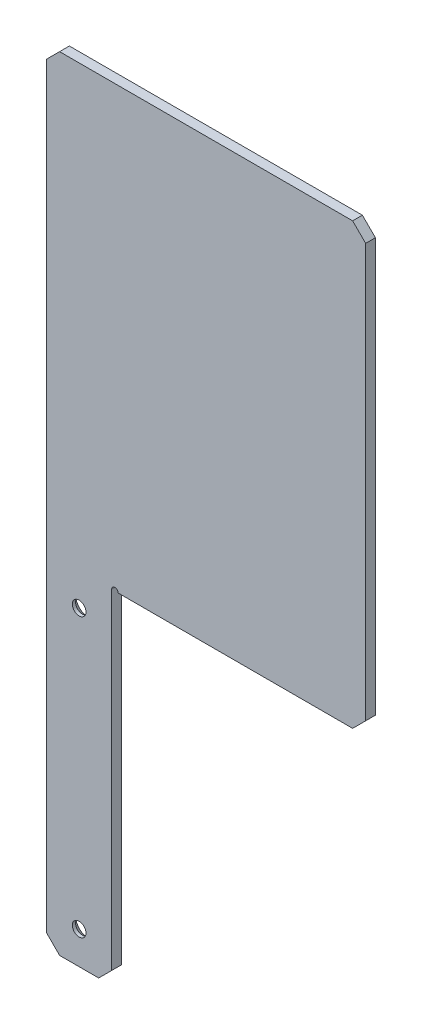
ISO-10303-21;
HEADER;
FILE_DESCRIPTION(('STEP AP214'),'2;1');
FILE_NAME('part.step','',(''),(''),'','','');
FILE_SCHEMA(('AUTOMOTIVE_DESIGN { 1 0 10303 214 1 1 1 1 }'));
ENDSEC;
DATA;
#1=APPLICATION_CONTEXT('core data for automotive mechanical design processes');
#2=APPLICATION_PROTOCOL_DEFINITION('international standard','automotive_design',2000,#1);
#3=PRODUCT_CONTEXT('',#1,'mechanical');
#4=PRODUCT('Part','Part','',(#3));
#5=PRODUCT_RELATED_PRODUCT_CATEGORY('part','',(#4));
#6=PRODUCT_DEFINITION_FORMATION('','',#4);
#7=PRODUCT_DEFINITION_CONTEXT('part definition',#1,'design');
#8=PRODUCT_DEFINITION('design','',#6,#7);
#9=PRODUCT_DEFINITION_SHAPE('','',#8);
#10=(LENGTH_UNIT() NAMED_UNIT(*) SI_UNIT(.MILLI.,.METRE.));
#11=(NAMED_UNIT(*) PLANE_ANGLE_UNIT() SI_UNIT($,.RADIAN.));
#12=(NAMED_UNIT(*) SI_UNIT($,.STERADIAN.) SOLID_ANGLE_UNIT());
#13=UNCERTAINTY_MEASURE_WITH_UNIT(LENGTH_MEASURE(1.E-05),#10,'distance_accuracy_value','');
#14=(GEOMETRIC_REPRESENTATION_CONTEXT(3) GLOBAL_UNCERTAINTY_ASSIGNED_CONTEXT((#13)) GLOBAL_UNIT_ASSIGNED_CONTEXT((#10,
#11,#12)) REPRESENTATION_CONTEXT('',''));
#15=CARTESIAN_POINT('',(0.,0.,0.));
#16=DIRECTION('',(0.,0.,1.));
#17=DIRECTION('',(1.,0.,0.));
#18=AXIS2_PLACEMENT_3D('',#15,#16,#17);
#19=CARTESIAN_POINT('',(-49.,-120.2,1.5));
#20=DIRECTION('',(0.,1.,0.));
#21=DIRECTION('',(0.,0.,1.));
#22=AXIS2_PLACEMENT_3D('',#19,#20,#21);
#23=PLANE('',#22);
#24=DIRECTION('',(1.,0.,0.));
#25=VECTOR('',#24,1.);
#26=CARTESIAN_POINT('',(-49.,-120.2,1.5));
#27=LINE('',#26,#25);
#28=CARTESIAN_POINT('',(-45.,-120.2,1.5));
#29=VERTEX_POINT('',#28);
#30=CARTESIAN_POINT('',(-33.,-120.2,1.5));
#31=VERTEX_POINT('',#30);
#32=EDGE_CURVE('E317',#29,#31,#27,.T.);
#33=ORIENTED_EDGE('',*,*,#32,.F.);
#34=DIRECTION('',(0.,0.,-1.));
#35=VECTOR('',#34,1.);
#36=CARTESIAN_POINT('',(-45.,-120.2,1.5));
#37=LINE('',#36,#35);
#38=CARTESIAN_POINT('',(-45.,-120.2,-1.5));
#39=VERTEX_POINT('',#38);
#40=EDGE_CURVE('E199',#29,#39,#37,.T.);
#41=ORIENTED_EDGE('',*,*,#40,.T.);
#42=DIRECTION('',(1.,0.,0.));
#43=VECTOR('',#42,1.);
#44=CARTESIAN_POINT('',(-49.,-120.2,-1.5));
#45=LINE('',#44,#43);
#46=CARTESIAN_POINT('',(-33.,-120.2,-1.5));
#47=VERTEX_POINT('',#46);
#48=EDGE_CURVE('E147',#39,#47,#45,.T.);
#49=ORIENTED_EDGE('',*,*,#48,.T.);
#50=DIRECTION('',(0.,0.,1.));
#51=VECTOR('',#50,1.);
#52=CARTESIAN_POINT('',(-33.,-120.2,1.5));
#53=LINE('',#52,#51);
#54=EDGE_CURVE('E197',#47,#31,#53,.T.);
#55=ORIENTED_EDGE('',*,*,#54,.T.);
#56=EDGE_LOOP('',(#33,#41,#49,#55));
#57=FACE_BOUND('',#56,.T.);
#58=ADVANCED_FACE('F37',(#57),#23,.F.);
#59=CARTESIAN_POINT('',(-29.,-120.2,1.5));
#60=DIRECTION('',(-1.,0.,0.));
#61=DIRECTION('',(0.,0.,1.));
#62=AXIS2_PLACEMENT_3D('',#59,#60,#61);
#63=PLANE('',#62);
#64=DIRECTION('',(0.,1.,0.));
#65=VECTOR('',#64,1.);
#66=CARTESIAN_POINT('',(-29.,-120.2,1.5));
#67=LINE('',#66,#65);
#68=CARTESIAN_POINT('',(-29.,-116.2,1.5));
#69=VERTEX_POINT('',#68);
#70=CARTESIAN_POINT('',(-29.,-14.8,1.5));
#71=VERTEX_POINT('',#70);
#72=EDGE_CURVE('E316',#69,#71,#67,.T.);
#73=ORIENTED_EDGE('',*,*,#72,.F.);
#74=DIRECTION('',(0.,0.,-1.));
#75=VECTOR('',#74,1.);
#76=CARTESIAN_POINT('',(-29.,-116.2,1.5));
#77=LINE('',#76,#75);
#78=CARTESIAN_POINT('',(-29.,-116.2,-1.5));
#79=VERTEX_POINT('',#78);
#80=EDGE_CURVE('E202',#69,#79,#77,.T.);
#81=ORIENTED_EDGE('',*,*,#80,.T.);
#82=DIRECTION('',(0.,1.,0.));
#83=VECTOR('',#82,1.);
#84=CARTESIAN_POINT('',(-29.,-120.2,-1.5));
#85=LINE('',#84,#83);
#86=CARTESIAN_POINT('',(-29.,-14.8,-1.5));
#87=VERTEX_POINT('',#86);
#88=EDGE_CURVE('E154',#79,#87,#85,.T.);
#89=ORIENTED_EDGE('',*,*,#88,.T.);
#90=DIRECTION('',(0.,0.,-1.));
#91=VECTOR('',#90,1.);
#92=CARTESIAN_POINT('',(-29.,-14.8,1.5));
#93=LINE('',#92,#91);
#94=EDGE_CURVE('E133',#71,#87,#93,.T.);
#95=ORIENTED_EDGE('',*,*,#94,.F.);
#96=EDGE_LOOP('',(#73,#81,#89,#95));
#97=FACE_BOUND('',#96,.T.);
#98=ADVANCED_FACE('F240',(#97),#63,.F.);
#99=CARTESIAN_POINT('',(-29.,-14.8,1.5));
#100=DIRECTION('',(0.,1.,0.));
#101=DIRECTION('',(0.,0.,1.));
#102=AXIS2_PLACEMENT_3D('',#99,#100,#101);
#103=PLANE('',#102);
#104=DIRECTION('',(1.,0.,0.));
#105=VECTOR('',#104,1.);
#106=CARTESIAN_POINT('',(-29.,-14.8,1.5));
#107=LINE('',#106,#105);
#108=CARTESIAN_POINT('',(-27.,-14.8,1.5));
#109=VERTEX_POINT('',#108);
#110=CARTESIAN_POINT('',(45.,-14.8,1.5));
#111=VERTEX_POINT('',#110);
#112=EDGE_CURVE('E146',#109,#111,#107,.T.);
#113=ORIENTED_EDGE('',*,*,#112,.F.);
#114=DIRECTION('',(0.,0.,1.));
#115=VECTOR('',#114,1.);
#116=CARTESIAN_POINT('',(-27.,-14.8,-1.5));
#117=LINE('',#116,#115);
#118=CARTESIAN_POINT('',(-27.,-14.8,-1.5));
#119=VERTEX_POINT('',#118);
#120=EDGE_CURVE('E130',#109,#119,#117,.F.);
#121=ORIENTED_EDGE('',*,*,#120,.T.);
#122=DIRECTION('',(1.,0.,0.));
#123=VECTOR('',#122,1.);
#124=CARTESIAN_POINT('',(-29.,-14.8,-1.5));
#125=LINE('',#124,#123);
#126=CARTESIAN_POINT('',(45.,-14.8,-1.5));
#127=VERTEX_POINT('',#126);
#128=EDGE_CURVE('E144',#119,#127,#125,.T.);
#129=ORIENTED_EDGE('',*,*,#128,.T.);
#130=DIRECTION('',(0.,0.,1.));
#131=VECTOR('',#130,1.);
#132=CARTESIAN_POINT('',(45.,-14.8,1.5));
#133=LINE('',#132,#131);
#134=EDGE_CURVE('E209',#127,#111,#133,.T.);
#135=ORIENTED_EDGE('',*,*,#134,.T.);
#136=EDGE_LOOP('',(#113,#121,#129,#135));
#137=FACE_BOUND('',#136,.T.);
#138=ADVANCED_FACE('F142',(#137),#103,.F.);
#139=CARTESIAN_POINT('',(49.,-14.8,1.5));
#140=DIRECTION('',(-1.,0.,0.));
#141=DIRECTION('',(0.,0.,1.));
#142=AXIS2_PLACEMENT_3D('',#139,#140,#141);
#143=PLANE('',#142);
#144=DIRECTION('',(0.,1.,0.));
#145=VECTOR('',#144,1.);
#146=CARTESIAN_POINT('',(49.,-14.8,1.5));
#147=LINE('',#146,#145);
#148=CARTESIAN_POINT('',(49.,-10.8,1.5));
#149=VERTEX_POINT('',#148);
#150=CARTESIAN_POINT('',(49.,116.2,1.5));
#151=VERTEX_POINT('',#150);
#152=EDGE_CURVE('E299',#149,#151,#147,.T.);
#153=ORIENTED_EDGE('',*,*,#152,.F.);
#154=DIRECTION('',(0.,0.,-1.));
#155=VECTOR('',#154,1.);
#156=CARTESIAN_POINT('',(49.,-10.8,1.5));
#157=LINE('',#156,#155);
#158=CARTESIAN_POINT('',(49.,-10.8,-1.5));
#159=VERTEX_POINT('',#158);
#160=EDGE_CURVE('E206',#149,#159,#157,.T.);
#161=ORIENTED_EDGE('',*,*,#160,.T.);
#162=DIRECTION('',(0.,1.,0.));
#163=VECTOR('',#162,1.);
#164=CARTESIAN_POINT('',(49.,-14.8,-1.5));
#165=LINE('',#164,#163);
#166=CARTESIAN_POINT('',(49.,116.2,-1.5));
#167=VERTEX_POINT('',#166);
#168=EDGE_CURVE('E153',#159,#167,#165,.T.);
#169=ORIENTED_EDGE('',*,*,#168,.T.);
#170=DIRECTION('',(0.,0.,1.));
#171=VECTOR('',#170,1.);
#172=CARTESIAN_POINT('',(49.,116.2,1.5));
#173=LINE('',#172,#171);
#174=EDGE_CURVE('E53',#167,#151,#173,.T.);
#175=ORIENTED_EDGE('',*,*,#174,.T.);
#176=EDGE_LOOP('',(#153,#161,#169,#175));
#177=FACE_BOUND('',#176,.T.);
#178=ADVANCED_FACE('F350',(#177),#143,.F.);
#179=CARTESIAN_POINT('',(49.,120.2,1.5));
#180=DIRECTION('',(0.,-1.,0.));
#181=DIRECTION('',(0.,0.,-1.));
#182=AXIS2_PLACEMENT_3D('',#179,#180,#181);
#183=PLANE('',#182);
#184=DIRECTION('',(-1.,0.,0.));
#185=VECTOR('',#184,1.);
#186=CARTESIAN_POINT('',(49.,120.2,-1.5));
#187=LINE('',#186,#185);
#188=CARTESIAN_POINT('',(45.,120.2,-1.5));
#189=VERTEX_POINT('',#188);
#190=CARTESIAN_POINT('',(-45.,120.2,-1.5));
#191=VERTEX_POINT('',#190);
#192=EDGE_CURVE('E156',#189,#191,#187,.T.);
#193=ORIENTED_EDGE('',*,*,#192,.T.);
#194=DIRECTION('',(0.,0.,1.));
#195=VECTOR('',#194,1.);
#196=CARTESIAN_POINT('',(-45.,120.2,1.5));
#197=LINE('',#196,#195);
#198=CARTESIAN_POINT('',(-45.,120.2,1.5));
#199=VERTEX_POINT('',#198);
#200=EDGE_CURVE('E186',#191,#199,#197,.T.);
#201=ORIENTED_EDGE('',*,*,#200,.T.);
#202=DIRECTION('',(-1.,0.,0.));
#203=VECTOR('',#202,1.);
#204=CARTESIAN_POINT('',(49.,120.2,1.5));
#205=LINE('',#204,#203);
#206=CARTESIAN_POINT('',(45.,120.2,1.5));
#207=VERTEX_POINT('',#206);
#208=EDGE_CURVE('E169',#207,#199,#205,.T.);
#209=ORIENTED_EDGE('',*,*,#208,.F.);
#210=DIRECTION('',(0.,0.,-1.));
#211=VECTOR('',#210,1.);
#212=CARTESIAN_POINT('',(45.,120.2,1.5));
#213=LINE('',#212,#211);
#214=EDGE_CURVE('E183',#207,#189,#213,.T.);
#215=ORIENTED_EDGE('',*,*,#214,.T.);
#216=EDGE_LOOP('',(#193,#201,#209,#215));
#217=FACE_BOUND('',#216,.T.);
#218=ADVANCED_FACE('F301',(#217),#183,.F.);
#219=CARTESIAN_POINT('',(-49.,-14.8,1.5));
#220=DIRECTION('',(1.,0.,0.));
#221=DIRECTION('',(0.,0.,-1.));
#222=AXIS2_PLACEMENT_3D('',#219,#220,#221);
#223=PLANE('',#222);
#224=DIRECTION('',(0.,-1.,0.));
#225=VECTOR('',#224,1.);
#226=CARTESIAN_POINT('',(-49.,-14.8,1.5));
#227=LINE('',#226,#225);
#228=CARTESIAN_POINT('',(-49.,116.2,1.5));
#229=VERTEX_POINT('',#228);
#230=CARTESIAN_POINT('',(-49.,-116.2,1.5));
#231=VERTEX_POINT('',#230);
#232=EDGE_CURVE('E166',#229,#231,#227,.T.);
#233=ORIENTED_EDGE('',*,*,#232,.F.);
#234=DIRECTION('',(0.,0.,-1.));
#235=VECTOR('',#234,1.);
#236=CARTESIAN_POINT('',(-49.,116.2,1.5));
#237=LINE('',#236,#235);
#238=CARTESIAN_POINT('',(-49.,116.2,-1.5));
#239=VERTEX_POINT('',#238);
#240=EDGE_CURVE('E171',#229,#239,#237,.T.);
#241=ORIENTED_EDGE('',*,*,#240,.T.);
#242=DIRECTION('',(0.,-1.,0.));
#243=VECTOR('',#242,1.);
#244=CARTESIAN_POINT('',(-49.,-14.8,-1.5));
#245=LINE('',#244,#243);
#246=CARTESIAN_POINT('',(-49.,-116.2,-1.5));
#247=VERTEX_POINT('',#246);
#248=EDGE_CURVE('E163',#239,#247,#245,.T.);
#249=ORIENTED_EDGE('',*,*,#248,.T.);
#250=DIRECTION('',(0.,0.,1.));
#251=VECTOR('',#250,1.);
#252=CARTESIAN_POINT('',(-49.,-116.2,1.5));
#253=LINE('',#252,#251);
#254=EDGE_CURVE('E168',#247,#231,#253,.T.);
#255=ORIENTED_EDGE('',*,*,#254,.T.);
#256=EDGE_LOOP('',(#233,#241,#249,#255));
#257=FACE_BOUND('',#256,.T.);
#258=ADVANCED_FACE('F333',(#257),#223,.F.);
#259=CARTESIAN_POINT('',(0.,0.,1.5));
#260=DIRECTION('',(0.,0.,1.));
#261=DIRECTION('',(1.,0.,0.));
#262=AXIS2_PLACEMENT_3D('',#259,#260,#261);
#263=PLANE('',#262);
#264=CARTESIAN_POINT('',(-39.,-110.2,1.5));
#265=DIRECTION('',(0.,0.,1.));
#266=DIRECTION('',(1.,0.,0.));
#267=AXIS2_PLACEMENT_3D('',#264,#265,#266);
#268=CIRCLE('',#267,2.1);
#269=CARTESIAN_POINT('',(-36.9,-110.2,1.5));
#270=VERTEX_POINT('',#269);
#271=EDGE_CURVE('E323',#270,#270,#268,.T.);
#272=ORIENTED_EDGE('',*,*,#271,.F.);
#273=EDGE_LOOP('',(#272));
#274=FACE_BOUND('',#273,.T.);
#275=CARTESIAN_POINT('',(-39.,-24.8,1.5));
#276=DIRECTION('',(0.,0.,1.));
#277=DIRECTION('',(1.,0.,0.));
#278=AXIS2_PLACEMENT_3D('',#275,#276,#277);
#279=CIRCLE('',#278,2.1);
#280=CARTESIAN_POINT('',(-36.9,-24.8,1.5));
#281=VERTEX_POINT('',#280);
#282=EDGE_CURVE('E325',#281,#281,#279,.T.);
#283=ORIENTED_EDGE('',*,*,#282,.F.);
#284=EDGE_LOOP('',(#283));
#285=FACE_BOUND('',#284,.T.);
#286=CARTESIAN_POINT('',(-28.,-14.8,1.5));
#287=DIRECTION('',(0.,0.,1.));
#288=DIRECTION('',(1.,0.,0.));
#289=AXIS2_PLACEMENT_3D('',#286,#287,#288);
#290=CIRCLE('',#289,0.999999999999998);
#291=EDGE_CURVE('E138',#109,#71,#290,.T.);
#292=ORIENTED_EDGE('',*,*,#291,.F.);
#293=ORIENTED_EDGE('',*,*,#112,.T.);
#294=DIRECTION('',(-0.70710678118655,-0.707106781186545,0.));
#295=VECTOR('',#294,1.);
#296=CARTESIAN_POINT('',(29.8999999999998,-29.9,1.5));
#297=LINE('',#296,#295);
#298=EDGE_CURVE('E60',#111,#149,#297,.F.);
#299=ORIENTED_EDGE('',*,*,#298,.T.);
#300=ORIENTED_EDGE('',*,*,#152,.T.);
#301=DIRECTION('',(0.707106781186545,-0.70710678118655,0.));
#302=VECTOR('',#301,1.);
#303=CARTESIAN_POINT('',(82.6000000000002,82.5999999999996,1.5));
#304=LINE('',#303,#302);
#305=EDGE_CURVE('E188',#151,#207,#304,.F.);
#306=ORIENTED_EDGE('',*,*,#305,.T.);
#307=ORIENTED_EDGE('',*,*,#208,.T.);
#308=DIRECTION('',(0.70710678118655,0.707106781186545,0.));
#309=VECTOR('',#308,1.);
#310=CARTESIAN_POINT('',(-82.5999999999998,82.6000000000004,1.5));
#311=LINE('',#310,#309);
#312=EDGE_CURVE('E195',#199,#229,#311,.F.);
#313=ORIENTED_EDGE('',*,*,#312,.T.);
#314=ORIENTED_EDGE('',*,*,#232,.T.);
#315=DIRECTION('',(-0.707106781186545,0.70710678118655,0.));
#316=VECTOR('',#315,1.);
#317=CARTESIAN_POINT('',(-82.6000000000002,-82.5999999999996,1.5));
#318=LINE('',#317,#316);
#319=EDGE_CURVE('E193',#231,#29,#318,.F.);
#320=ORIENTED_EDGE('',*,*,#319,.T.);
#321=ORIENTED_EDGE('',*,*,#32,.T.);
#322=DIRECTION('',(-0.70710678118655,-0.707106781186545,0.));
#323=VECTOR('',#322,1.);
#324=CARTESIAN_POINT('',(43.6000000000001,-43.6000000000004,1.5));
#325=LINE('',#324,#323);
#326=EDGE_CURVE('E191',#31,#69,#325,.F.);
#327=ORIENTED_EDGE('',*,*,#326,.T.);
#328=ORIENTED_EDGE('',*,*,#72,.T.);
#329=EDGE_LOOP('',(#292,#293,#299,#300,#306,#307,#313,#314,#320,#321,#327,#328));
#330=FACE_BOUND('',#329,.T.);
#331=ADVANCED_FACE('F230',(#274,#285,#330),#263,.T.);
#332=CARTESIAN_POINT('',(0.,0.,-1.5));
#333=DIRECTION('',(0.,0.,1.));
#334=DIRECTION('',(1.,0.,0.));
#335=AXIS2_PLACEMENT_3D('',#332,#333,#334);
#336=PLANE('',#335);
#337=CARTESIAN_POINT('',(-39.,-110.2,-1.5));
#338=DIRECTION('',(0.,0.,1.));
#339=DIRECTION('',(1.,0.,0.));
#340=AXIS2_PLACEMENT_3D('',#337,#338,#339);
#341=CIRCLE('',#340,4.09999999999997);
#342=CARTESIAN_POINT('',(-34.9,-110.2,-1.5));
#343=VERTEX_POINT('',#342);
#344=EDGE_CURVE('E214',#343,#343,#341,.T.);
#345=ORIENTED_EDGE('',*,*,#344,.T.);
#346=EDGE_LOOP('',(#345));
#347=FACE_BOUND('',#346,.T.);
#348=CARTESIAN_POINT('',(-39.,-24.8,-1.5));
#349=DIRECTION('',(0.,0.,1.));
#350=DIRECTION('',(1.,0.,0.));
#351=AXIS2_PLACEMENT_3D('',#348,#349,#350);
#352=CIRCLE('',#351,4.10000000000005);
#353=CARTESIAN_POINT('',(-34.8999999999999,-24.8,-1.5));
#354=VERTEX_POINT('',#353);
#355=EDGE_CURVE('E211',#354,#354,#352,.T.);
#356=ORIENTED_EDGE('',*,*,#355,.T.);
#357=EDGE_LOOP('',(#356));
#358=FACE_BOUND('',#357,.T.);
#359=ORIENTED_EDGE('',*,*,#128,.F.);
#360=CARTESIAN_POINT('',(-28.,-14.8,-1.5));
#361=DIRECTION('',(0.,0.,1.));
#362=DIRECTION('',(1.,0.,0.));
#363=AXIS2_PLACEMENT_3D('',#360,#361,#362);
#364=CIRCLE('',#363,0.999999999999998);
#365=EDGE_CURVE('E127',#119,#87,#364,.T.);
#366=ORIENTED_EDGE('',*,*,#365,.T.);
#367=ORIENTED_EDGE('',*,*,#88,.F.);
#368=DIRECTION('',(0.70710678118655,0.707106781186545,0.));
#369=VECTOR('',#368,1.);
#370=CARTESIAN_POINT('',(-29.,-116.2,-1.5));
#371=LINE('',#370,#369);
#372=EDGE_CURVE('E177',#79,#47,#371,.F.);
#373=ORIENTED_EDGE('',*,*,#372,.T.);
#374=ORIENTED_EDGE('',*,*,#48,.F.);
#375=DIRECTION('',(0.707106781186545,-0.70710678118655,0.));
#376=VECTOR('',#375,1.);
#377=CARTESIAN_POINT('',(-45.,-120.2,-1.5));
#378=LINE('',#377,#376);
#379=EDGE_CURVE('E179',#39,#247,#378,.F.);
#380=ORIENTED_EDGE('',*,*,#379,.T.);
#381=ORIENTED_EDGE('',*,*,#248,.F.);
#382=DIRECTION('',(-0.70710678118655,-0.707106781186545,0.));
#383=VECTOR('',#382,1.);
#384=CARTESIAN_POINT('',(-49.,116.2,-1.5));
#385=LINE('',#384,#383);
#386=EDGE_CURVE('E181',#239,#191,#385,.F.);
#387=ORIENTED_EDGE('',*,*,#386,.T.);
#388=ORIENTED_EDGE('',*,*,#192,.F.);
#389=DIRECTION('',(-0.707106781186545,0.70710678118655,0.));
#390=VECTOR('',#389,1.);
#391=CARTESIAN_POINT('',(45.,120.2,-1.5));
#392=LINE('',#391,#390);
#393=EDGE_CURVE('E174',#189,#167,#392,.F.);
#394=ORIENTED_EDGE('',*,*,#393,.T.);
#395=ORIENTED_EDGE('',*,*,#168,.F.);
#396=DIRECTION('',(0.70710678118655,0.707106781186545,0.));
#397=VECTOR('',#396,1.);
#398=CARTESIAN_POINT('',(49.,-10.8,-1.5));
#399=LINE('',#398,#397);
#400=EDGE_CURVE('E151',#159,#127,#399,.F.);
#401=ORIENTED_EDGE('',*,*,#400,.T.);
#402=EDGE_LOOP('',(#359,#366,#367,#373,#374,#380,#381,#387,#388,#394,#395,#401));
#403=FACE_BOUND('',#402,.T.);
#404=ADVANCED_FACE('F149',(#347,#358,#403),#336,.F.);
#405=CARTESIAN_POINT('',(-49.,116.2,1.5));
#406=DIRECTION('',(0.707106781186545,-0.70710678118655,0.));
#407=DIRECTION('',(0.,0.,-1.));
#408=AXIS2_PLACEMENT_3D('',#405,#406,#407);
#409=PLANE('',#408);
#410=ORIENTED_EDGE('',*,*,#312,.F.);
#411=ORIENTED_EDGE('',*,*,#200,.F.);
#412=ORIENTED_EDGE('',*,*,#386,.F.);
#413=ORIENTED_EDGE('',*,*,#240,.F.);
#414=EDGE_LOOP('',(#410,#411,#412,#413));
#415=FACE_BOUND('',#414,.T.);
#416=ADVANCED_FACE('F229',(#415),#409,.F.);
#417=CARTESIAN_POINT('',(-45.,-120.2,1.5));
#418=DIRECTION('',(0.70710678118655,0.707106781186545,0.));
#419=DIRECTION('',(0.,0.,-1.));
#420=AXIS2_PLACEMENT_3D('',#417,#418,#419);
#421=PLANE('',#420);
#422=ORIENTED_EDGE('',*,*,#319,.F.);
#423=ORIENTED_EDGE('',*,*,#254,.F.);
#424=ORIENTED_EDGE('',*,*,#379,.F.);
#425=ORIENTED_EDGE('',*,*,#40,.F.);
#426=EDGE_LOOP('',(#422,#423,#424,#425));
#427=FACE_BOUND('',#426,.T.);
#428=ADVANCED_FACE('F257',(#427),#421,.F.);
#429=CARTESIAN_POINT('',(-29.,-116.2,1.5));
#430=DIRECTION('',(-0.707106781186545,0.70710678118655,0.));
#431=DIRECTION('',(0.,0.,-1.));
#432=AXIS2_PLACEMENT_3D('',#429,#430,#431);
#433=PLANE('',#432);
#434=ORIENTED_EDGE('',*,*,#326,.F.);
#435=ORIENTED_EDGE('',*,*,#54,.F.);
#436=ORIENTED_EDGE('',*,*,#372,.F.);
#437=ORIENTED_EDGE('',*,*,#80,.F.);
#438=EDGE_LOOP('',(#434,#435,#436,#437));
#439=FACE_BOUND('',#438,.T.);
#440=ADVANCED_FACE('F264',(#439),#433,.F.);
#441=CARTESIAN_POINT('',(49.,-10.8,1.5));
#442=DIRECTION('',(-0.707106781186545,0.70710678118655,0.));
#443=DIRECTION('',(0.,0.,-1.));
#444=AXIS2_PLACEMENT_3D('',#441,#442,#443);
#445=PLANE('',#444);
#446=ORIENTED_EDGE('',*,*,#298,.F.);
#447=ORIENTED_EDGE('',*,*,#134,.F.);
#448=ORIENTED_EDGE('',*,*,#400,.F.);
#449=ORIENTED_EDGE('',*,*,#160,.F.);
#450=EDGE_LOOP('',(#446,#447,#448,#449));
#451=FACE_BOUND('',#450,.T.);
#452=ADVANCED_FACE('F271',(#451),#445,.F.);
#453=CARTESIAN_POINT('',(45.,120.2,1.5));
#454=DIRECTION('',(-0.70710678118655,-0.707106781186545,0.));
#455=DIRECTION('',(0.,0.,-1.));
#456=AXIS2_PLACEMENT_3D('',#453,#454,#455);
#457=PLANE('',#456);
#458=ORIENTED_EDGE('',*,*,#305,.F.);
#459=ORIENTED_EDGE('',*,*,#174,.F.);
#460=ORIENTED_EDGE('',*,*,#393,.F.);
#461=ORIENTED_EDGE('',*,*,#214,.F.);
#462=EDGE_LOOP('',(#458,#459,#460,#461));
#463=FACE_BOUND('',#462,.T.);
#464=ADVANCED_FACE('F278',(#463),#457,.F.);
#465=CARTESIAN_POINT('',(-28.,-14.8,-1.5));
#466=DIRECTION('',(0.,0.,1.));
#467=DIRECTION('',(1.,0.,0.));
#468=AXIS2_PLACEMENT_3D('',#465,#466,#467);
#469=CYLINDRICAL_SURFACE('',#468,0.999999999999998);
#470=ORIENTED_EDGE('',*,*,#365,.F.);
#471=ORIENTED_EDGE('',*,*,#120,.F.);
#472=ORIENTED_EDGE('',*,*,#291,.T.);
#473=ORIENTED_EDGE('',*,*,#94,.T.);
#474=EDGE_LOOP('',(#470,#471,#472,#473));
#475=FACE_BOUND('',#474,.T.);
#476=ADVANCED_FACE('F129',(#475),#469,.F.);
#477=CARTESIAN_POINT('',(-39.,-24.8,-1.5));
#478=DIRECTION('',(0.,0.,1.));
#479=DIRECTION('',(1.,0.,0.));
#480=AXIS2_PLACEMENT_3D('',#477,#478,#479);
#481=CYLINDRICAL_SURFACE('',#480,2.1);
#482=CARTESIAN_POINT('',(-39.,-24.8,0.500000000000043));
#483=DIRECTION('',(0.,0.,1.));
#484=DIRECTION('',(1.,0.,0.));
#485=AXIS2_PLACEMENT_3D('',#482,#483,#484);
#486=CIRCLE('',#485,2.1);
#487=CARTESIAN_POINT('',(-36.9,-24.8,0.500000000000043));
#488=VERTEX_POINT('',#487);
#489=EDGE_CURVE('E11',#488,#488,#486,.F.);
#490=ORIENTED_EDGE('',*,*,#489,.T.);
#491=EDGE_LOOP('',(#490));
#492=FACE_BOUND('',#491,.T.);
#493=ORIENTED_EDGE('',*,*,#282,.T.);
#494=EDGE_LOOP('',(#493));
#495=FACE_BOUND('',#494,.T.);
#496=ADVANCED_FACE('F292',(#492,#495),#481,.F.);
#497=CARTESIAN_POINT('',(-39.,-110.2,-1.5));
#498=DIRECTION('',(0.,0.,1.));
#499=DIRECTION('',(1.,0.,0.));
#500=AXIS2_PLACEMENT_3D('',#497,#498,#499);
#501=CYLINDRICAL_SURFACE('',#500,2.1);
#502=CARTESIAN_POINT('',(-39.,-110.2,0.499999999999987));
#503=DIRECTION('',(0.,0.,1.));
#504=DIRECTION('',(1.,0.,0.));
#505=AXIS2_PLACEMENT_3D('',#502,#503,#504);
#506=CIRCLE('',#505,2.1);
#507=CARTESIAN_POINT('',(-36.9,-110.2,0.499999999999987));
#508=VERTEX_POINT('',#507);
#509=EDGE_CURVE('E46',#508,#508,#506,.F.);
#510=ORIENTED_EDGE('',*,*,#509,.T.);
#511=EDGE_LOOP('',(#510));
#512=FACE_BOUND('',#511,.T.);
#513=ORIENTED_EDGE('',*,*,#271,.T.);
#514=EDGE_LOOP('',(#513));
#515=FACE_BOUND('',#514,.T.);
#516=ADVANCED_FACE('F219',(#512,#515),#501,.F.);
#517=CARTESIAN_POINT('',(-39.,-110.2,-1.5));
#518=DIRECTION('',(0.,0.,-1.));
#519=DIRECTION('',(-1.,0.,0.));
#520=AXIS2_PLACEMENT_3D('',#517,#518,#519);
#521=CONICAL_SURFACE('',#520,4.09999999999997,0.785398163397443);
#522=ORIENTED_EDGE('',*,*,#509,.F.);
#523=EDGE_LOOP('',(#522));
#524=FACE_BOUND('',#523,.T.);
#525=ORIENTED_EDGE('',*,*,#344,.F.);
#526=EDGE_LOOP('',(#525));
#527=FACE_BOUND('',#526,.T.);
#528=ADVANCED_FACE('F222',(#524,#527),#521,.F.);
#529=CARTESIAN_POINT('',(-39.,-24.8,-1.5));
#530=DIRECTION('',(0.,0.,-1.));
#531=DIRECTION('',(-1.,0.,0.));
#532=AXIS2_PLACEMENT_3D('',#529,#530,#531);
#533=CONICAL_SURFACE('',#532,4.10000000000005,0.78539816339745);
#534=ORIENTED_EDGE('',*,*,#489,.F.);
#535=EDGE_LOOP('',(#534));
#536=FACE_BOUND('',#535,.T.);
#537=ORIENTED_EDGE('',*,*,#355,.F.);
#538=EDGE_LOOP('',(#537));
#539=FACE_BOUND('',#538,.T.);
#540=ADVANCED_FACE('F40',(#536,#539),#533,.F.);
#541=CLOSED_SHELL('',(#58,#98,#138,#178,#218,#258,#331,#404,#416,#428,#440,#452,#464,#476,#496,
#516,#528,#540));
#542=MANIFOLD_SOLID_BREP('B2',#541);
#543=ADVANCED_BREP_SHAPE_REPRESENTATION('',(#18,#542),#14);
#544=SHAPE_DEFINITION_REPRESENTATION(#9,#543);
ENDSEC;
END-ISO-10303-21;
